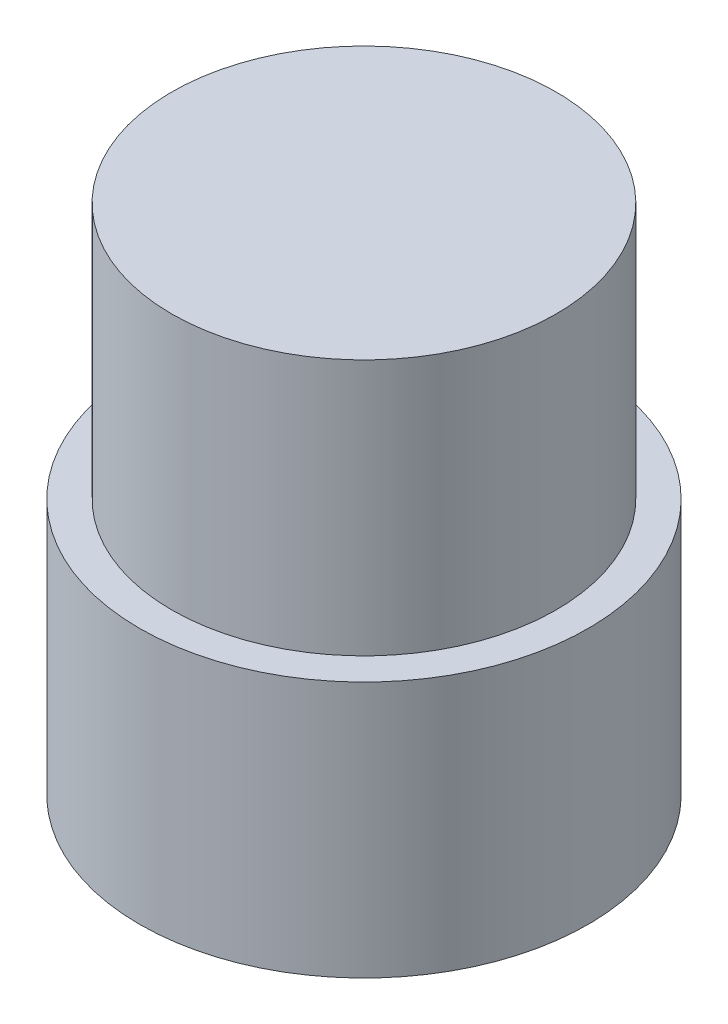
ISO-10303-21;
HEADER;
FILE_DESCRIPTION(('STEP AP214'),'2;1');
FILE_NAME('part.step','',(''),(''),'','','');
FILE_SCHEMA(('AUTOMOTIVE_DESIGN { 1 0 10303 214 1 1 1 1 }'));
ENDSEC;
DATA;
#1=APPLICATION_CONTEXT('core data for automotive mechanical design processes');
#2=APPLICATION_PROTOCOL_DEFINITION('international standard','automotive_design',2000,#1);
#3=PRODUCT_CONTEXT('',#1,'mechanical');
#4=PRODUCT('Part','Part','',(#3));
#5=PRODUCT_RELATED_PRODUCT_CATEGORY('part','',(#4));
#6=PRODUCT_DEFINITION_FORMATION('','',#4);
#7=PRODUCT_DEFINITION_CONTEXT('part definition',#1,'design');
#8=PRODUCT_DEFINITION('design','',#6,#7);
#9=PRODUCT_DEFINITION_SHAPE('','',#8);
#10=(LENGTH_UNIT() NAMED_UNIT(*) SI_UNIT(.MILLI.,.METRE.));
#11=(NAMED_UNIT(*) PLANE_ANGLE_UNIT() SI_UNIT($,.RADIAN.));
#12=(NAMED_UNIT(*) SI_UNIT($,.STERADIAN.) SOLID_ANGLE_UNIT());
#13=UNCERTAINTY_MEASURE_WITH_UNIT(LENGTH_MEASURE(1.E-05),#10,'distance_accuracy_value','');
#14=(GEOMETRIC_REPRESENTATION_CONTEXT(3) GLOBAL_UNCERTAINTY_ASSIGNED_CONTEXT((#13)) GLOBAL_UNIT_ASSIGNED_CONTEXT((#10,
#11,#12)) REPRESENTATION_CONTEXT('',''));
#15=CARTESIAN_POINT('',(0.,0.,0.));
#16=DIRECTION('',(0.,0.,1.));
#17=DIRECTION('',(1.,0.,0.));
#18=AXIS2_PLACEMENT_3D('',#15,#16,#17);
#19=CARTESIAN_POINT('',(0.,2.,0.));
#20=DIRECTION('',(0.,-1.,0.));
#21=DIRECTION('',(0.,0.,-1.));
#22=AXIS2_PLACEMENT_3D('',#19,#20,#21);
#23=CYLINDRICAL_SURFACE('',#22,1.75);
#24=CARTESIAN_POINT('',(0.,2.,0.));
#25=DIRECTION('',(0.,1.,0.));
#26=DIRECTION('',(0.,0.,1.));
#27=AXIS2_PLACEMENT_3D('',#24,#25,#26);
#28=CIRCLE('',#27,1.75);
#29=CARTESIAN_POINT('',(0.,2.,1.75));
#30=VERTEX_POINT('',#29);
#31=EDGE_CURVE('E44',#30,#30,#28,.T.);
#32=ORIENTED_EDGE('',*,*,#31,.F.);
#33=EDGE_LOOP('',(#32));
#34=FACE_BOUND('',#33,.T.);
#35=CARTESIAN_POINT('',(0.,0.,0.));
#36=DIRECTION('',(0.,1.,0.));
#37=DIRECTION('',(0.,0.,1.));
#38=AXIS2_PLACEMENT_3D('',#35,#36,#37);
#39=CIRCLE('',#38,1.75);
#40=CARTESIAN_POINT('',(0.,0.,1.75));
#41=VERTEX_POINT('',#40);
#42=EDGE_CURVE('E40',#41,#41,#39,.T.);
#43=ORIENTED_EDGE('',*,*,#42,.T.);
#44=EDGE_LOOP('',(#43));
#45=FACE_BOUND('',#44,.T.);
#46=ADVANCED_FACE('F37',(#34,#45),#23,.T.);
#47=CARTESIAN_POINT('',(0.,2.,0.));
#48=DIRECTION('',(0.,1.,0.));
#49=DIRECTION('',(0.,0.,1.));
#50=AXIS2_PLACEMENT_3D('',#47,#48,#49);
#51=PLANE('',#50);
#52=CARTESIAN_POINT('',(0.,2.,0.));
#53=DIRECTION('',(0.,1.,0.));
#54=DIRECTION('',(0.,0.,1.));
#55=AXIS2_PLACEMENT_3D('',#52,#53,#54);
#56=CIRCLE('',#55,1.5);
#57=CARTESIAN_POINT('',(0.,2.,1.5));
#58=VERTEX_POINT('',#57);
#59=EDGE_CURVE('E10',#58,#58,#56,.T.);
#60=ORIENTED_EDGE('',*,*,#59,.F.);
#61=EDGE_LOOP('',(#60));
#62=FACE_BOUND('',#61,.T.);
#63=ORIENTED_EDGE('',*,*,#31,.T.);
#64=EDGE_LOOP('',(#63));
#65=FACE_BOUND('',#64,.T.);
#66=ADVANCED_FACE('F61',(#62,#65),#51,.T.);
#67=CARTESIAN_POINT('',(0.,0.,0.));
#68=DIRECTION('',(0.,1.,0.));
#69=DIRECTION('',(0.,0.,1.));
#70=AXIS2_PLACEMENT_3D('',#67,#68,#69);
#71=PLANE('',#70);
#72=ORIENTED_EDGE('',*,*,#42,.F.);
#73=EDGE_LOOP('',(#72));
#74=FACE_BOUND('',#73,.T.);
#75=ADVANCED_FACE('F58',(#74),#71,.F.);
#76=CARTESIAN_POINT('',(0.,4.,0.));
#77=DIRECTION('',(0.,-1.,0.));
#78=DIRECTION('',(0.,0.,-1.));
#79=AXIS2_PLACEMENT_3D('',#76,#77,#78);
#80=CYLINDRICAL_SURFACE('',#79,1.5);
#81=CARTESIAN_POINT('',(0.,4.,0.));
#82=DIRECTION('',(0.,1.,0.));
#83=DIRECTION('',(0.,0.,1.));
#84=AXIS2_PLACEMENT_3D('',#81,#82,#83);
#85=CIRCLE('',#84,1.5);
#86=CARTESIAN_POINT('',(0.,4.,1.5));
#87=VERTEX_POINT('',#86);
#88=EDGE_CURVE('E50',#87,#87,#85,.T.);
#89=ORIENTED_EDGE('',*,*,#88,.F.);
#90=EDGE_LOOP('',(#89));
#91=FACE_BOUND('',#90,.T.);
#92=ORIENTED_EDGE('',*,*,#59,.T.);
#93=EDGE_LOOP('',(#92));
#94=FACE_BOUND('',#93,.T.);
#95=ADVANCED_FACE('F60',(#91,#94),#80,.T.);
#96=CARTESIAN_POINT('',(0.,4.,0.));
#97=DIRECTION('',(0.,1.,0.));
#98=DIRECTION('',(0.,0.,1.));
#99=AXIS2_PLACEMENT_3D('',#96,#97,#98);
#100=PLANE('',#99);
#101=ORIENTED_EDGE('',*,*,#88,.T.);
#102=EDGE_LOOP('',(#101));
#103=FACE_BOUND('',#102,.T.);
#104=ADVANCED_FACE('F67',(#103),#100,.T.);
#105=CLOSED_SHELL('',(#46,#66,#75,#95,#104));
#106=MANIFOLD_SOLID_BREP('B2',#105);
#107=ADVANCED_BREP_SHAPE_REPRESENTATION('',(#18,#106),#14);
#108=SHAPE_DEFINITION_REPRESENTATION(#9,#107);
ENDSEC;
END-ISO-10303-21;
